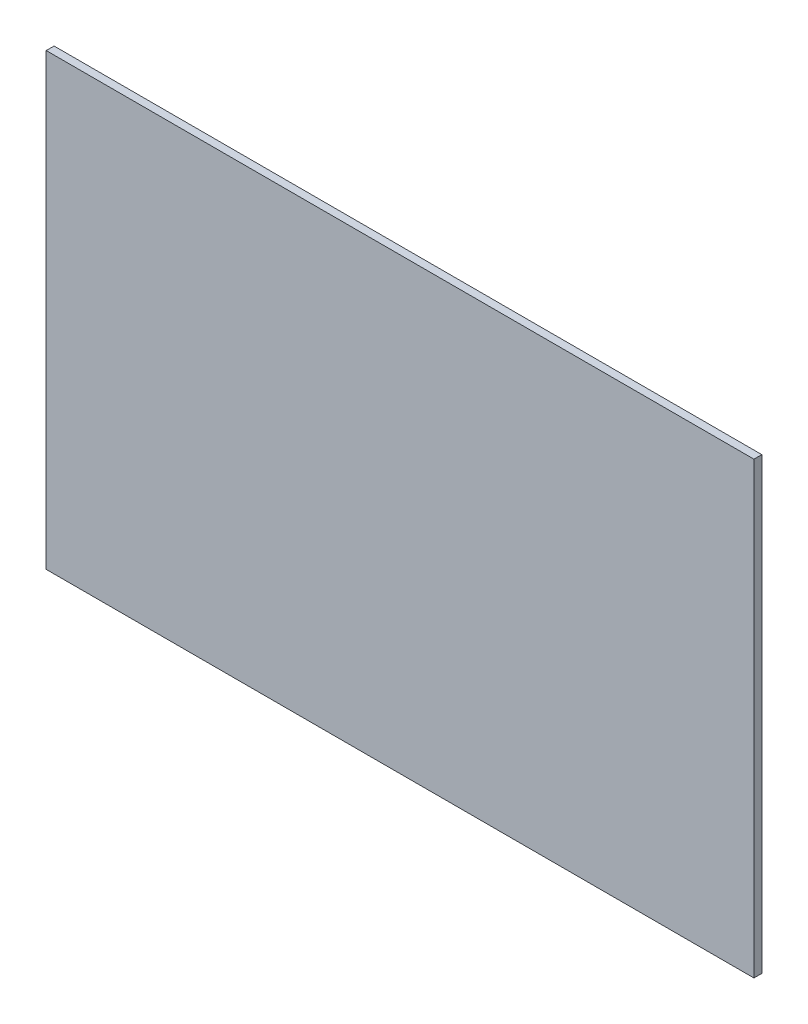
ISO-10303-21;
HEADER;
FILE_DESCRIPTION(('STEP AP214'),'2;1');
FILE_NAME('part.step','',(''),(''),'','','');
FILE_SCHEMA(('AUTOMOTIVE_DESIGN { 1 0 10303 214 1 1 1 1 }'));
ENDSEC;
DATA;
#1=APPLICATION_CONTEXT('core data for automotive mechanical design processes');
#2=APPLICATION_PROTOCOL_DEFINITION('international standard','automotive_design',2000,#1);
#3=PRODUCT_CONTEXT('',#1,'mechanical');
#4=PRODUCT('Part','Part','',(#3));
#5=PRODUCT_RELATED_PRODUCT_CATEGORY('part','',(#4));
#6=PRODUCT_DEFINITION_FORMATION('','',#4);
#7=PRODUCT_DEFINITION_CONTEXT('part definition',#1,'design');
#8=PRODUCT_DEFINITION('design','',#6,#7);
#9=PRODUCT_DEFINITION_SHAPE('','',#8);
#10=(LENGTH_UNIT() NAMED_UNIT(*) SI_UNIT(.MILLI.,.METRE.));
#11=(NAMED_UNIT(*) PLANE_ANGLE_UNIT() SI_UNIT($,.RADIAN.));
#12=(NAMED_UNIT(*) SI_UNIT($,.STERADIAN.) SOLID_ANGLE_UNIT());
#13=UNCERTAINTY_MEASURE_WITH_UNIT(LENGTH_MEASURE(1.E-05),#10,'distance_accuracy_value','');
#14=(GEOMETRIC_REPRESENTATION_CONTEXT(3) GLOBAL_UNCERTAINTY_ASSIGNED_CONTEXT((#13)) GLOBAL_UNIT_ASSIGNED_CONTEXT((#10,
#11,#12)) REPRESENTATION_CONTEXT('',''));
#15=CARTESIAN_POINT('',(0.,0.,0.));
#16=DIRECTION('',(0.,0.,1.));
#17=DIRECTION('',(1.,0.,0.));
#18=AXIS2_PLACEMENT_3D('',#15,#16,#17);
#19=CARTESIAN_POINT('',(0.,-400.,7.));
#20=DIRECTION('',(1.,0.,0.));
#21=DIRECTION('',(0.,0.,-1.));
#22=AXIS2_PLACEMENT_3D('',#19,#20,#21);
#23=PLANE('',#22);
#24=DIRECTION('',(0.,-1.,0.));
#25=VECTOR('',#24,1.);
#26=CARTESIAN_POINT('',(0.,-400.,0.));
#27=LINE('',#26,#25);
#28=CARTESIAN_POINT('',(0.,0.,0.));
#29=VERTEX_POINT('',#28);
#30=CARTESIAN_POINT('',(0.,-400.,0.));
#31=VERTEX_POINT('',#30);
#32=EDGE_CURVE('E79',#29,#31,#27,.T.);
#33=ORIENTED_EDGE('',*,*,#32,.T.);
#34=DIRECTION('',(0.,0.,-1.));
#35=VECTOR('',#34,1.);
#36=CARTESIAN_POINT('',(0.,-400.,7.));
#37=LINE('',#36,#35);
#38=CARTESIAN_POINT('',(0.,-400.,7.));
#39=VERTEX_POINT('',#38);
#40=EDGE_CURVE('E156',#39,#31,#37,.T.);
#41=ORIENTED_EDGE('',*,*,#40,.F.);
#42=DIRECTION('',(0.,-1.,0.));
#43=VECTOR('',#42,1.);
#44=CARTESIAN_POINT('',(0.,-18.630210667597,7.));
#45=LINE('',#44,#43);
#46=CARTESIAN_POINT('',(0.,0.,7.));
#47=VERTEX_POINT('',#46);
#48=EDGE_CURVE('E84',#47,#39,#45,.T.);
#49=ORIENTED_EDGE('',*,*,#48,.F.);
#50=DIRECTION('',(0.,0.,-1.));
#51=VECTOR('',#50,1.);
#52=CARTESIAN_POINT('',(0.,0.,7.));
#53=LINE('',#52,#51);
#54=EDGE_CURVE('E142',#47,#29,#53,.T.);
#55=ORIENTED_EDGE('',*,*,#54,.T.);
#56=EDGE_LOOP('',(#33,#41,#49,#55));
#57=FACE_BOUND('',#56,.T.);
#58=ADVANCED_FACE('F35',(#57),#23,.F.);
#59=CARTESIAN_POINT('',(630.,-400.,7.));
#60=DIRECTION('',(0.,1.,0.));
#61=DIRECTION('',(0.,0.,1.));
#62=AXIS2_PLACEMENT_3D('',#59,#60,#61);
#63=PLANE('',#62);
#64=DIRECTION('',(1.,0.,0.));
#65=VECTOR('',#64,1.);
#66=CARTESIAN_POINT('',(630.,-400.,0.));
#67=LINE('',#66,#65);
#68=CARTESIAN_POINT('',(630.,-400.,0.));
#69=VERTEX_POINT('',#68);
#70=EDGE_CURVE('E130',#31,#69,#67,.T.);
#71=ORIENTED_EDGE('',*,*,#70,.T.);
#72=DIRECTION('',(0.,0.,-1.));
#73=VECTOR('',#72,1.);
#74=CARTESIAN_POINT('',(630.,-400.,7.));
#75=LINE('',#74,#73);
#76=CARTESIAN_POINT('',(630.,-400.,7.));
#77=VERTEX_POINT('',#76);
#78=EDGE_CURVE('E153',#77,#69,#75,.T.);
#79=ORIENTED_EDGE('',*,*,#78,.F.);
#80=DIRECTION('',(1.,0.,0.));
#81=VECTOR('',#80,1.);
#82=CARTESIAN_POINT('',(630.,-400.,7.));
#83=LINE('',#82,#81);
#84=EDGE_CURVE('E137',#39,#77,#83,.T.);
#85=ORIENTED_EDGE('',*,*,#84,.F.);
#86=ORIENTED_EDGE('',*,*,#40,.T.);
#87=EDGE_LOOP('',(#71,#79,#85,#86));
#88=FACE_BOUND('',#87,.T.);
#89=ADVANCED_FACE('F182',(#88),#63,.F.);
#90=CARTESIAN_POINT('',(630.,0.,7.));
#91=DIRECTION('',(-1.,0.,0.));
#92=DIRECTION('',(0.,0.,1.));
#93=AXIS2_PLACEMENT_3D('',#90,#91,#92);
#94=PLANE('',#93);
#95=DIRECTION('',(0.,1.,0.));
#96=VECTOR('',#95,1.);
#97=CARTESIAN_POINT('',(630.,0.,0.));
#98=LINE('',#97,#96);
#99=CARTESIAN_POINT('',(630.,0.,0.));
#100=VERTEX_POINT('',#99);
#101=EDGE_CURVE('E145',#69,#100,#98,.T.);
#102=ORIENTED_EDGE('',*,*,#101,.T.);
#103=DIRECTION('',(0.,0.,-1.));
#104=VECTOR('',#103,1.);
#105=CARTESIAN_POINT('',(630.,0.,7.));
#106=LINE('',#105,#104);
#107=CARTESIAN_POINT('',(630.,0.,7.));
#108=VERTEX_POINT('',#107);
#109=EDGE_CURVE('E150',#108,#100,#106,.T.);
#110=ORIENTED_EDGE('',*,*,#109,.F.);
#111=DIRECTION('',(0.,1.,0.));
#112=VECTOR('',#111,1.);
#113=CARTESIAN_POINT('',(630.,0.,7.));
#114=LINE('',#113,#112);
#115=EDGE_CURVE('E140',#77,#108,#114,.T.);
#116=ORIENTED_EDGE('',*,*,#115,.F.);
#117=ORIENTED_EDGE('',*,*,#78,.T.);
#118=EDGE_LOOP('',(#102,#110,#116,#117));
#119=FACE_BOUND('',#118,.T.);
#120=ADVANCED_FACE('F187',(#119),#94,.F.);
#121=CARTESIAN_POINT('',(0.,0.,7.));
#122=DIRECTION('',(0.,-1.,0.));
#123=DIRECTION('',(0.,0.,-1.));
#124=AXIS2_PLACEMENT_3D('',#121,#122,#123);
#125=PLANE('',#124);
#126=DIRECTION('',(-1.,0.,0.));
#127=VECTOR('',#126,1.);
#128=CARTESIAN_POINT('',(0.,0.,0.));
#129=LINE('',#128,#127);
#130=EDGE_CURVE('E138',#100,#29,#129,.T.);
#131=ORIENTED_EDGE('',*,*,#130,.T.);
#132=ORIENTED_EDGE('',*,*,#54,.F.);
#133=DIRECTION('',(-1.,0.,0.));
#134=VECTOR('',#133,1.);
#135=CARTESIAN_POINT('',(0.,0.,7.));
#136=LINE('',#135,#134);
#137=EDGE_CURVE('E58',#108,#47,#136,.T.);
#138=ORIENTED_EDGE('',*,*,#137,.F.);
#139=ORIENTED_EDGE('',*,*,#109,.T.);
#140=EDGE_LOOP('',(#131,#132,#138,#139));
#141=FACE_BOUND('',#140,.T.);
#142=ADVANCED_FACE('F196',(#141),#125,.F.);
#143=CARTESIAN_POINT('',(0.,0.,7.));
#144=DIRECTION('',(0.,0.,-1.));
#145=DIRECTION('',(-1.,0.,0.));
#146=AXIS2_PLACEMENT_3D('',#143,#144,#145);
#147=PLANE('',#146);
#148=ORIENTED_EDGE('',*,*,#48,.T.);
#149=ORIENTED_EDGE('',*,*,#84,.T.);
#150=ORIENTED_EDGE('',*,*,#115,.T.);
#151=ORIENTED_EDGE('',*,*,#137,.T.);
#152=EDGE_LOOP('',(#148,#149,#150,#151));
#153=FACE_BOUND('',#152,.T.);
#154=ADVANCED_FACE('F179',(#153),#147,.F.);
#155=CARTESIAN_POINT('',(0.,0.,0.));
#156=DIRECTION('',(0.,0.,-1.));
#157=DIRECTION('',(-1.,0.,0.));
#158=AXIS2_PLACEMENT_3D('',#155,#156,#157);
#159=PLANE('',#158);
#160=DIRECTION('',(0.,-1.,0.));
#161=VECTOR('',#160,1.);
#162=CARTESIAN_POINT('',(385.47114234671,-230.001109881714,0.));
#163=LINE('',#162,#161);
#164=CARTESIAN_POINT('',(385.47114234671,-230.001109881714,0.));
#165=VERTEX_POINT('',#164);
#166=CARTESIAN_POINT('',(385.47114234671,-300.001109881714,0.));
#167=VERTEX_POINT('',#166);
#168=EDGE_CURVE('E321',#165,#167,#163,.T.);
#169=ORIENTED_EDGE('',*,*,#168,.F.);
#170=DIRECTION('',(1.,0.,0.));
#171=VECTOR('',#170,1.);
#172=CARTESIAN_POINT('',(245.47114234671,-230.001109881714,0.));
#173=LINE('',#172,#171);
#174=CARTESIAN_POINT('',(245.47114234671,-230.001109881714,0.));
#175=VERTEX_POINT('',#174);
#176=EDGE_CURVE('E318',#175,#165,#173,.T.);
#177=ORIENTED_EDGE('',*,*,#176,.F.);
#178=DIRECTION('',(0.,1.,0.));
#179=VECTOR('',#178,1.);
#180=CARTESIAN_POINT('',(245.47114234671,-300.001109881714,0.));
#181=LINE('',#180,#179);
#182=CARTESIAN_POINT('',(245.47114234671,-300.001109881714,0.));
#183=VERTEX_POINT('',#182);
#184=EDGE_CURVE('E125',#183,#175,#181,.T.);
#185=ORIENTED_EDGE('',*,*,#184,.F.);
#186=DIRECTION('',(-1.,0.,0.));
#187=VECTOR('',#186,1.);
#188=CARTESIAN_POINT('',(315.47114234671,-300.001109881714,0.));
#189=LINE('',#188,#187);
#190=EDGE_CURVE('E329',#167,#183,#189,.T.);
#191=ORIENTED_EDGE('',*,*,#190,.F.);
#192=EDGE_LOOP('',(#169,#177,#185,#191));
#193=FACE_BOUND('',#192,.T.);
#194=ORIENTED_EDGE('',*,*,#32,.F.);
#195=ORIENTED_EDGE('',*,*,#130,.F.);
#196=ORIENTED_EDGE('',*,*,#101,.F.);
#197=ORIENTED_EDGE('',*,*,#70,.F.);
#198=EDGE_LOOP('',(#194,#195,#196,#197));
#199=FACE_BOUND('',#198,.T.);
#200=ADVANCED_FACE('F167',(#193,#199),#159,.T.);
#201=CARTESIAN_POINT('',(0.,0.,-7.));
#202=DIRECTION('',(0.,0.,-1.));
#203=DIRECTION('',(-1.,0.,0.));
#204=AXIS2_PLACEMENT_3D('',#201,#202,#203);
#205=PLANE('',#204);
#206=CARTESIAN_POINT('',(315.572226811321,-278.546162476001,-7.));
#207=DIRECTION('',(0.,0.,-1.));
#208=DIRECTION('',(-1.,0.,0.));
#209=AXIS2_PLACEMENT_3D('',#206,#207,#208);
#210=CIRCLE('',#209,2.99999999999999);
#211=CARTESIAN_POINT('',(312.572226811321,-278.546162476001,-7.));
#212=VERTEX_POINT('',#211);
#213=EDGE_CURVE('E316',#212,#212,#210,.T.);
#214=ORIENTED_EDGE('',*,*,#213,.F.);
#215=EDGE_LOOP('',(#214));
#216=FACE_BOUND('',#215,.T.);
#217=DIRECTION('',(0.,1.,0.));
#218=VECTOR('',#217,1.);
#219=CARTESIAN_POINT('',(245.47114234671,-250.001109881714,-7.));
#220=LINE('',#219,#218);
#221=CARTESIAN_POINT('',(245.47114234671,-300.001109881714,-7.));
#222=VERTEX_POINT('',#221);
#223=CARTESIAN_POINT('',(245.47114234671,-230.001109881714,-7.));
#224=VERTEX_POINT('',#223);
#225=EDGE_CURVE('E119',#222,#224,#220,.T.);
#226=ORIENTED_EDGE('',*,*,#225,.T.);
#227=DIRECTION('',(1.,0.,0.));
#228=VECTOR('',#227,1.);
#229=CARTESIAN_POINT('',(245.47114234671,-230.001109881714,-7.));
#230=LINE('',#229,#228);
#231=CARTESIAN_POINT('',(385.47114234671,-230.001109881714,-7.));
#232=VERTEX_POINT('',#231);
#233=EDGE_CURVE('E108',#224,#232,#230,.T.);
#234=ORIENTED_EDGE('',*,*,#233,.T.);
#235=DIRECTION('',(0.,-1.,0.));
#236=VECTOR('',#235,1.);
#237=CARTESIAN_POINT('',(385.47114234671,-230.001109881714,-7.));
#238=LINE('',#237,#236);
#239=CARTESIAN_POINT('',(385.47114234671,-300.001109881714,-7.));
#240=VERTEX_POINT('',#239);
#241=EDGE_CURVE('E118',#232,#240,#238,.T.);
#242=ORIENTED_EDGE('',*,*,#241,.T.);
#243=DIRECTION('',(-1.,0.,0.));
#244=VECTOR('',#243,1.);
#245=CARTESIAN_POINT('',(385.47114234671,-300.001109881714,-7.));
#246=LINE('',#245,#244);
#247=EDGE_CURVE('E124',#240,#222,#246,.T.);
#248=ORIENTED_EDGE('',*,*,#247,.T.);
#249=EDGE_LOOP('',(#226,#234,#242,#248));
#250=FACE_BOUND('',#249,.T.);
#251=CARTESIAN_POINT('',(330.572226811321,-278.546162476001,-7.));
#252=DIRECTION('',(0.,0.,-1.));
#253=DIRECTION('',(-1.,0.,0.));
#254=AXIS2_PLACEMENT_3D('',#251,#252,#253);
#255=CIRCLE('',#254,0.499999999999973);
#256=CARTESIAN_POINT('',(330.072226811321,-278.546162476001,-7.));
#257=VERTEX_POINT('',#256);
#258=EDGE_CURVE('E319',#257,#257,#255,.T.);
#259=ORIENTED_EDGE('',*,*,#258,.F.);
#260=EDGE_LOOP('',(#259));
#261=FACE_BOUND('',#260,.T.);
#262=ADVANCED_FACE('F121',(#216,#250,#261),#205,.T.);
#263=CARTESIAN_POINT('',(245.47114234671,-230.001109881714,-7.));
#264=DIRECTION('',(0.,-1.,0.));
#265=DIRECTION('',(0.,0.,-1.));
#266=AXIS2_PLACEMENT_3D('',#263,#264,#265);
#267=PLANE('',#266);
#268=ORIENTED_EDGE('',*,*,#176,.T.);
#269=DIRECTION('',(0.,0.,1.));
#270=VECTOR('',#269,1.);
#271=CARTESIAN_POINT('',(385.47114234671,-230.001109881714,-7.));
#272=LINE('',#271,#270);
#273=EDGE_CURVE('E115',#232,#165,#272,.T.);
#274=ORIENTED_EDGE('',*,*,#273,.F.);
#275=ORIENTED_EDGE('',*,*,#233,.F.);
#276=DIRECTION('',(0.,0.,1.));
#277=VECTOR('',#276,1.);
#278=CARTESIAN_POINT('',(245.47114234671,-230.001109881714,-7.));
#279=LINE('',#278,#277);
#280=EDGE_CURVE('E112',#224,#175,#279,.T.);
#281=ORIENTED_EDGE('',*,*,#280,.T.);
#282=EDGE_LOOP('',(#268,#274,#275,#281));
#283=FACE_BOUND('',#282,.T.);
#284=ADVANCED_FACE('F110',(#283),#267,.F.);
#285=CARTESIAN_POINT('',(385.47114234671,-230.001109881714,-7.));
#286=DIRECTION('',(-1.,0.,0.));
#287=DIRECTION('',(0.,0.,1.));
#288=AXIS2_PLACEMENT_3D('',#285,#286,#287);
#289=PLANE('',#288);
#290=ORIENTED_EDGE('',*,*,#168,.T.);
#291=DIRECTION('',(0.,0.,1.));
#292=VECTOR('',#291,1.);
#293=CARTESIAN_POINT('',(385.47114234671,-300.001109881714,-7.));
#294=LINE('',#293,#292);
#295=EDGE_CURVE('E132',#240,#167,#294,.T.);
#296=ORIENTED_EDGE('',*,*,#295,.F.);
#297=ORIENTED_EDGE('',*,*,#241,.F.);
#298=ORIENTED_EDGE('',*,*,#273,.T.);
#299=EDGE_LOOP('',(#290,#296,#297,#298));
#300=FACE_BOUND('',#299,.T.);
#301=ADVANCED_FACE('F260',(#300),#289,.F.);
#302=CARTESIAN_POINT('',(315.47114234671,-300.001109881714,-7.));
#303=DIRECTION('',(0.,1.,0.));
#304=DIRECTION('',(0.,0.,1.));
#305=AXIS2_PLACEMENT_3D('',#302,#303,#304);
#306=PLANE('',#305);
#307=ORIENTED_EDGE('',*,*,#190,.T.);
#308=DIRECTION('',(0.,0.,1.));
#309=VECTOR('',#308,1.);
#310=CARTESIAN_POINT('',(245.47114234671,-300.001109881714,-7.));
#311=LINE('',#310,#309);
#312=EDGE_CURVE('E49',#222,#183,#311,.T.);
#313=ORIENTED_EDGE('',*,*,#312,.F.);
#314=ORIENTED_EDGE('',*,*,#247,.F.);
#315=ORIENTED_EDGE('',*,*,#295,.T.);
#316=EDGE_LOOP('',(#307,#313,#314,#315));
#317=FACE_BOUND('',#316,.T.);
#318=ADVANCED_FACE('F268',(#317),#306,.F.);
#319=CARTESIAN_POINT('',(245.47114234671,-300.001109881714,-7.));
#320=DIRECTION('',(1.,0.,0.));
#321=DIRECTION('',(0.,0.,-1.));
#322=AXIS2_PLACEMENT_3D('',#319,#320,#321);
#323=PLANE('',#322);
#324=ORIENTED_EDGE('',*,*,#184,.T.);
#325=ORIENTED_EDGE('',*,*,#280,.F.);
#326=ORIENTED_EDGE('',*,*,#225,.F.);
#327=ORIENTED_EDGE('',*,*,#312,.T.);
#328=EDGE_LOOP('',(#324,#325,#326,#327));
#329=FACE_BOUND('',#328,.T.);
#330=ADVANCED_FACE('F127',(#329),#323,.F.);
#331=CARTESIAN_POINT('',(315.572226811321,-278.546162476001,-7.));
#332=DIRECTION('',(0.,0.,1.));
#333=DIRECTION('',(1.,0.,0.));
#334=AXIS2_PLACEMENT_3D('',#331,#332,#333);
#335=CYLINDRICAL_SURFACE('',#334,2.99999999999999);
#336=ORIENTED_EDGE('',*,*,#213,.T.);
#337=EDGE_LOOP('',(#336));
#338=FACE_BOUND('',#337,.T.);
#339=CARTESIAN_POINT('',(315.572226811321,-278.546162476001,0.));
#340=DIRECTION('',(0.,0.,-1.));
#341=DIRECTION('',(-1.,0.,0.));
#342=AXIS2_PLACEMENT_3D('',#339,#340,#341);
#343=CIRCLE('',#342,2.99999999999999);
#344=CARTESIAN_POINT('',(312.572226811321,-278.546162476001,0.));
#345=VERTEX_POINT('',#344);
#346=EDGE_CURVE('E11',#345,#345,#343,.F.);
#347=ORIENTED_EDGE('',*,*,#346,.T.);
#348=EDGE_LOOP('',(#347));
#349=FACE_BOUND('',#348,.T.);
#350=ADVANCED_FACE('F173',(#338,#349),#335,.F.);
#351=CARTESIAN_POINT('',(330.572226811321,-278.546162476001,-7.));
#352=DIRECTION('',(0.,0.,1.));
#353=DIRECTION('',(1.,0.,0.));
#354=AXIS2_PLACEMENT_3D('',#351,#352,#353);
#355=CYLINDRICAL_SURFACE('',#354,0.499999999999973);
#356=ORIENTED_EDGE('',*,*,#258,.T.);
#357=EDGE_LOOP('',(#356));
#358=FACE_BOUND('',#357,.T.);
#359=CARTESIAN_POINT('',(330.572226811321,-278.546162476001,0.));
#360=DIRECTION('',(0.,0.,-1.));
#361=DIRECTION('',(-1.,0.,0.));
#362=AXIS2_PLACEMENT_3D('',#359,#360,#361);
#363=CIRCLE('',#362,0.499999999999973);
#364=CARTESIAN_POINT('',(330.072226811321,-278.546162476001,0.));
#365=VERTEX_POINT('',#364);
#366=EDGE_CURVE('E42',#365,#365,#363,.F.);
#367=ORIENTED_EDGE('',*,*,#366,.T.);
#368=EDGE_LOOP('',(#367));
#369=FACE_BOUND('',#368,.T.);
#370=ADVANCED_FACE('F161',(#358,#369),#355,.F.);
#371=ORIENTED_EDGE('',*,*,#366,.F.);
#372=EDGE_LOOP('',(#371));
#373=FACE_BOUND('',#372,.T.);
#374=ADVANCED_FACE('F163',(#373),#159,.T.);
#375=ORIENTED_EDGE('',*,*,#346,.F.);
#376=EDGE_LOOP('',(#375));
#377=FACE_BOUND('',#376,.T.);
#378=ADVANCED_FACE('F165',(#377),#159,.T.);
#379=CLOSED_SHELL('',(#58,#89,#120,#142,#154,#200,#262,#284,#301,#318,#330,#350,#370,#374,#378));
#380=MANIFOLD_SOLID_BREP('B2',#379);
#381=ADVANCED_BREP_SHAPE_REPRESENTATION('',(#18,#380),#14);
#382=SHAPE_DEFINITION_REPRESENTATION(#9,#381);
ENDSEC;
END-ISO-10303-21;
